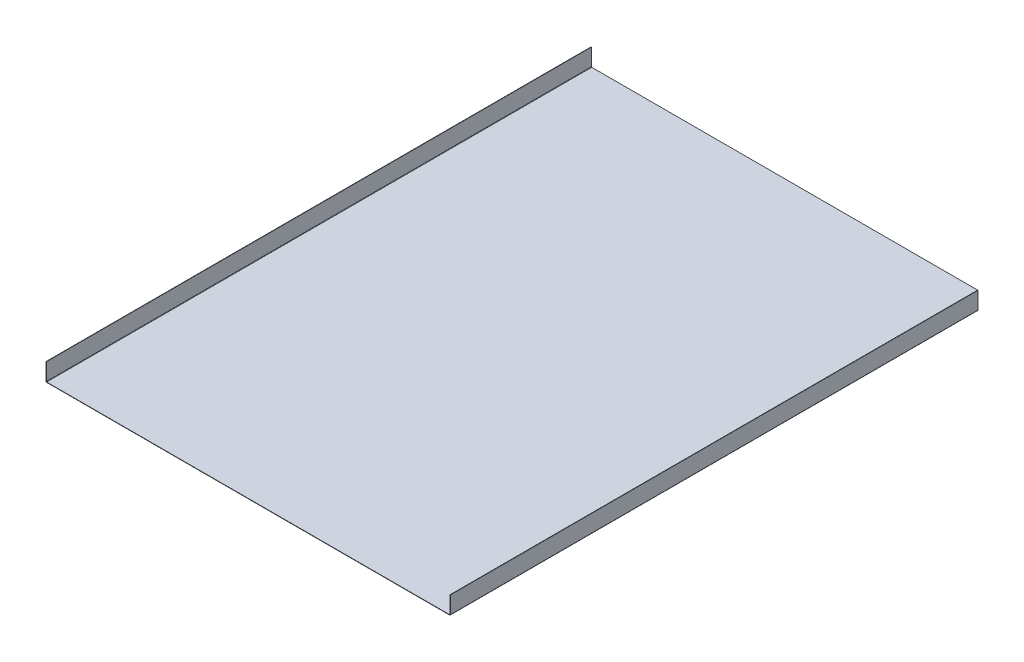
ISO-10303-21;
HEADER;
FILE_DESCRIPTION(('STEP AP214'),'2;1');
FILE_NAME('part.step','',(''),(''),'','','');
FILE_SCHEMA(('AUTOMOTIVE_DESIGN { 1 0 10303 214 1 1 1 1 }'));
ENDSEC;
DATA;
#1=APPLICATION_CONTEXT('core data for automotive mechanical design processes');
#2=APPLICATION_PROTOCOL_DEFINITION('international standard','automotive_design',2000,#1);
#3=PRODUCT_CONTEXT('',#1,'mechanical');
#4=PRODUCT('Part','Part','',(#3));
#5=PRODUCT_RELATED_PRODUCT_CATEGORY('part','',(#4));
#6=PRODUCT_DEFINITION_FORMATION('','',#4);
#7=PRODUCT_DEFINITION_CONTEXT('part definition',#1,'design');
#8=PRODUCT_DEFINITION('design','',#6,#7);
#9=PRODUCT_DEFINITION_SHAPE('','',#8);
#10=(LENGTH_UNIT() NAMED_UNIT(*) SI_UNIT(.MILLI.,.METRE.));
#11=(NAMED_UNIT(*) PLANE_ANGLE_UNIT() SI_UNIT($,.RADIAN.));
#12=(NAMED_UNIT(*) SI_UNIT($,.STERADIAN.) SOLID_ANGLE_UNIT());
#13=UNCERTAINTY_MEASURE_WITH_UNIT(LENGTH_MEASURE(1.E-05),#10,'distance_accuracy_value','');
#14=(GEOMETRIC_REPRESENTATION_CONTEXT(3) GLOBAL_UNCERTAINTY_ASSIGNED_CONTEXT((#13)) GLOBAL_UNIT_ASSIGNED_CONTEXT((#10,
#11,#12)) REPRESENTATION_CONTEXT('',''));
#15=CARTESIAN_POINT('',(0.,0.,0.));
#16=DIRECTION('',(0.,0.,1.));
#17=DIRECTION('',(1.,0.,0.));
#18=AXIS2_PLACEMENT_3D('',#15,#16,#17);
#19=CARTESIAN_POINT('',(473.8,0.,-598.));
#20=DIRECTION('',(0.,0.,1.));
#21=DIRECTION('',(0.,-1.,0.));
#22=AXIS2_PLACEMENT_3D('',#19,#20,#21);
#23=PLANE('',#22);
#24=DIRECTION('',(-1.,0.,0.));
#25=VECTOR('',#24,1.);
#26=CARTESIAN_POINT('',(473.8,0.,-598.));
#27=LINE('',#26,#25);
#28=CARTESIAN_POINT('',(473.8,0.,-598.));
#29=VERTEX_POINT('',#28);
#30=CARTESIAN_POINT('',(473.585640646055,0.,-598.));
#31=VERTEX_POINT('',#30);
#32=EDGE_CURVE('E295',#29,#31,#27,.T.);
#33=ORIENTED_EDGE('',*,*,#32,.T.);
#34=CARTESIAN_POINT('',(472.2,0.800000000000054,-598.));
#35=DIRECTION('',(0.,0.,-1.));
#36=DIRECTION('',(-1.,0.,0.));
#37=AXIS2_PLACEMENT_3D('',#34,#35,#36);
#38=CIRCLE('',#37,1.60000000000008);
#39=CARTESIAN_POINT('',(472.2,-0.8,-598.));
#40=VERTEX_POINT('',#39);
#41=EDGE_CURVE('E13',#31,#40,#38,.T.);
#42=ORIENTED_EDGE('',*,*,#41,.T.);
#43=DIRECTION('',(1.,0.,0.));
#44=VECTOR('',#43,1.);
#45=CARTESIAN_POINT('',(473.8,-0.8,-598.));
#46=LINE('',#45,#44);
#47=CARTESIAN_POINT('',(473.8,-0.8,-598.));
#48=VERTEX_POINT('',#47);
#49=EDGE_CURVE('E297',#40,#48,#46,.T.);
#50=ORIENTED_EDGE('',*,*,#49,.T.);
#51=DIRECTION('',(0.,-1.,0.));
#52=VECTOR('',#51,1.);
#53=CARTESIAN_POINT('',(473.8,-0.8,-598.));
#54=LINE('',#53,#52);
#55=EDGE_CURVE('E305',#48,#29,#54,.F.);
#56=ORIENTED_EDGE('',*,*,#55,.T.);
#57=EDGE_LOOP('',(#33,#42,#50,#56));
#58=FACE_BOUND('',#57,.T.);
#59=ADVANCED_FACE('F73',(#58),#23,.T.);
#60=CARTESIAN_POINT('',(473.8,-0.8,638.8));
#61=DIRECTION('',(0.,1.,0.));
#62=DIRECTION('',(0.,0.,1.));
#63=AXIS2_PLACEMENT_3D('',#60,#61,#62);
#64=PLANE('',#63);
#65=DIRECTION('',(0.,0.,1.));
#66=VECTOR('',#65,1.);
#67=CARTESIAN_POINT('',(-472.2,-0.800000000000109,638.8));
#68=LINE('',#67,#66);
#69=CARTESIAN_POINT('',(-472.2,-0.800000000000109,638.8));
#70=VERTEX_POINT('',#69);
#71=CARTESIAN_POINT('',(-472.2,-0.8,-638.8));
#72=VERTEX_POINT('',#71);
#73=EDGE_CURVE('E187',#70,#72,#68,.F.);
#74=ORIENTED_EDGE('',*,*,#73,.T.);
#75=DIRECTION('',(-1.,0.,0.));
#76=VECTOR('',#75,1.);
#77=CARTESIAN_POINT('',(-473.8,-0.8,-638.8));
#78=LINE('',#77,#76);
#79=CARTESIAN_POINT('',(433.,-0.8,-638.8));
#80=VERTEX_POINT('',#79);
#81=EDGE_CURVE('E310',#80,#72,#78,.T.);
#82=ORIENTED_EDGE('',*,*,#81,.F.);
#83=DIRECTION('',(0.707106781186548,0.,0.707106781186547));
#84=VECTOR('',#83,1.);
#85=CARTESIAN_POINT('',(1092.2,-0.8,20.3999999999992));
#86=LINE('',#85,#84);
#87=EDGE_CURVE('E299',#80,#48,#86,.T.);
#88=ORIENTED_EDGE('',*,*,#87,.T.);
#89=ORIENTED_EDGE('',*,*,#49,.F.);
#90=DIRECTION('',(0.,0.,-1.));
#91=VECTOR('',#90,1.);
#92=CARTESIAN_POINT('',(472.2,-0.800000000000024,-598.));
#93=LINE('',#92,#91);
#94=CARTESIAN_POINT('',(472.2,-0.8,638.8));
#95=VERTEX_POINT('',#94);
#96=EDGE_CURVE('E277',#40,#95,#93,.F.);
#97=ORIENTED_EDGE('',*,*,#96,.T.);
#98=DIRECTION('',(1.,0.,0.));
#99=VECTOR('',#98,1.);
#100=CARTESIAN_POINT('',(-473.8,-0.8,638.8));
#101=LINE('',#100,#99);
#102=EDGE_CURVE('E82',#70,#95,#101,.T.);
#103=ORIENTED_EDGE('',*,*,#102,.F.);
#104=EDGE_LOOP('',(#74,#82,#88,#89,#97,#103));
#105=FACE_BOUND('',#104,.T.);
#106=ADVANCED_FACE('F363',(#105),#64,.F.);
#107=CARTESIAN_POINT('',(473.8,0.,638.8));
#108=DIRECTION('',(0.,1.,0.));
#109=DIRECTION('',(0.,0.,1.));
#110=AXIS2_PLACEMENT_3D('',#107,#108,#109);
#111=PLANE('',#110);
#112=DIRECTION('',(-1.,0.,0.));
#113=VECTOR('',#112,1.);
#114=CARTESIAN_POINT('',(-473.8,0.,-638.8));
#115=LINE('',#114,#113);
#116=CARTESIAN_POINT('',(432.999999999999,0.,-638.8));
#117=VERTEX_POINT('',#116);
#118=CARTESIAN_POINT('',(-472.2,-1.08853898117545E-13,-638.8));
#119=VERTEX_POINT('',#118);
#120=EDGE_CURVE('E308',#117,#119,#115,.T.);
#121=ORIENTED_EDGE('',*,*,#120,.T.);
#122=DIRECTION('',(0.,0.,1.));
#123=VECTOR('',#122,1.);
#124=CARTESIAN_POINT('',(-472.2,-1.08853898117545E-13,638.8));
#125=LINE('',#124,#123);
#126=CARTESIAN_POINT('',(-472.2,-1.08853898117545E-13,638.8));
#127=VERTEX_POINT('',#126);
#128=EDGE_CURVE('E237',#127,#119,#125,.F.);
#129=ORIENTED_EDGE('',*,*,#128,.F.);
#130=DIRECTION('',(1.,0.,0.));
#131=VECTOR('',#130,1.);
#132=CARTESIAN_POINT('',(-473.8,0.,638.8));
#133=LINE('',#132,#131);
#134=CARTESIAN_POINT('',(472.2,0.,638.8));
#135=VERTEX_POINT('',#134);
#136=EDGE_CURVE('E77',#127,#135,#133,.T.);
#137=ORIENTED_EDGE('',*,*,#136,.T.);
#138=DIRECTION('',(0.,0.,-1.));
#139=VECTOR('',#138,1.);
#140=CARTESIAN_POINT('',(472.2,0.,-598.));
#141=LINE('',#140,#139);
#142=CARTESIAN_POINT('',(472.2,0.,-598.));
#143=VERTEX_POINT('',#142);
#144=EDGE_CURVE('E288',#143,#135,#141,.F.);
#145=ORIENTED_EDGE('',*,*,#144,.F.);
#146=EDGE_CURVE('E91',#31,#143,#27,.T.);
#147=ORIENTED_EDGE('',*,*,#146,.F.);
#148=ORIENTED_EDGE('',*,*,#32,.F.);
#149=DIRECTION('',(0.707106781186548,0.,0.707106781186547));
#150=VECTOR('',#149,1.);
#151=CARTESIAN_POINT('',(1092.2,0.,20.3999999999992));
#152=LINE('',#151,#150);
#153=EDGE_CURVE('E300',#117,#29,#152,.T.);
#154=ORIENTED_EDGE('',*,*,#153,.F.);
#155=EDGE_LOOP('',(#121,#129,#137,#145,#147,#148,#154));
#156=FACE_BOUND('',#155,.T.);
#157=ADVANCED_FACE('F318',(#156),#111,.T.);
#158=CARTESIAN_POINT('',(-473.8,-0.8,638.8));
#159=DIRECTION('',(0.,0.,1.));
#160=DIRECTION('',(1.,0.,0.));
#161=AXIS2_PLACEMENT_3D('',#158,#159,#160);
#162=PLANE('',#161);
#163=ORIENTED_EDGE('',*,*,#136,.F.);
#164=DIRECTION('',(1.38777878078121E-13,-1.,0.));
#165=VECTOR('',#164,1.);
#166=CARTESIAN_POINT('',(-472.2,-1.08853898117545E-13,638.8));
#167=LINE('',#166,#165);
#168=EDGE_CURVE('E233',#127,#70,#167,.T.);
#169=ORIENTED_EDGE('',*,*,#168,.T.);
#170=ORIENTED_EDGE('',*,*,#102,.T.);
#171=DIRECTION('',(0.,-1.,0.));
#172=VECTOR('',#171,1.);
#173=CARTESIAN_POINT('',(472.2,0.,638.8));
#174=LINE('',#173,#172);
#175=EDGE_CURVE('E282',#135,#95,#174,.T.);
#176=ORIENTED_EDGE('',*,*,#175,.F.);
#177=EDGE_LOOP('',(#163,#169,#170,#176));
#178=FACE_BOUND('',#177,.T.);
#179=ADVANCED_FACE('F320',(#178),#162,.T.);
#180=CARTESIAN_POINT('',(-473.8,-0.8,-638.8));
#181=DIRECTION('',(0.,0.,-1.));
#182=DIRECTION('',(-1.,0.,0.));
#183=AXIS2_PLACEMENT_3D('',#180,#181,#182);
#184=PLANE('',#183);
#185=DIRECTION('',(1.38777878078121E-13,-1.,0.));
#186=VECTOR('',#185,1.);
#187=CARTESIAN_POINT('',(-472.2,-1.08853898117545E-13,-638.8));
#188=LINE('',#187,#186);
#189=EDGE_CURVE('E241',#119,#72,#188,.T.);
#190=ORIENTED_EDGE('',*,*,#189,.F.);
#191=ORIENTED_EDGE('',*,*,#120,.F.);
#192=DIRECTION('',(0.,-1.,0.));
#193=VECTOR('',#192,1.);
#194=CARTESIAN_POINT('',(433.,-0.8,-638.8));
#195=LINE('',#194,#193);
#196=EDGE_CURVE('E302',#80,#117,#195,.F.);
#197=ORIENTED_EDGE('',*,*,#196,.F.);
#198=ORIENTED_EDGE('',*,*,#81,.T.);
#199=EDGE_LOOP('',(#190,#191,#197,#198));
#200=FACE_BOUND('',#199,.T.);
#201=ADVANCED_FACE('F75',(#200),#184,.T.);
#202=CARTESIAN_POINT('',(1092.2,-0.8,20.3999999999992));
#203=DIRECTION('',(-0.707106781186547,0.,0.707106781186548));
#204=DIRECTION('',(0.707106781186548,0.,0.707106781186547));
#205=AXIS2_PLACEMENT_3D('',#202,#203,#204);
#206=PLANE('',#205);
#207=ORIENTED_EDGE('',*,*,#55,.F.);
#208=ORIENTED_EDGE('',*,*,#87,.F.);
#209=ORIENTED_EDGE('',*,*,#196,.T.);
#210=ORIENTED_EDGE('',*,*,#153,.T.);
#211=EDGE_LOOP('',(#207,#208,#209,#210));
#212=FACE_BOUND('',#211,.T.);
#213=ADVANCED_FACE('F373',(#212),#206,.F.);
#214=CARTESIAN_POINT('',(472.2,0.800000000000054,638.8));
#215=DIRECTION('',(0.,0.,1.));
#216=DIRECTION('',(1.,0.,0.));
#217=AXIS2_PLACEMENT_3D('',#214,#215,#216);
#218=PLANE('',#217);
#219=DIRECTION('',(-1.,0.,0.));
#220=VECTOR('',#219,1.);
#221=CARTESIAN_POINT('',(473.8,0.80000000000002,638.8));
#222=LINE('',#221,#220);
#223=CARTESIAN_POINT('',(473.,0.800000000000051,638.8));
#224=VERTEX_POINT('',#223);
#225=CARTESIAN_POINT('',(473.8,0.800000000000047,638.8));
#226=VERTEX_POINT('',#225);
#227=EDGE_CURVE('E244',#224,#226,#222,.F.);
#228=ORIENTED_EDGE('',*,*,#227,.F.);
#229=CARTESIAN_POINT('',(472.2,0.800000000000054,638.8));
#230=DIRECTION('',(0.,0.,-1.));
#231=DIRECTION('',(-1.,0.,0.));
#232=AXIS2_PLACEMENT_3D('',#229,#230,#231);
#233=CIRCLE('',#232,0.800000000000078);
#234=EDGE_CURVE('E285',#135,#224,#233,.F.);
#235=ORIENTED_EDGE('',*,*,#234,.F.);
#236=ORIENTED_EDGE('',*,*,#175,.T.);
#237=CARTESIAN_POINT('',(472.2,0.800000000000054,638.8));
#238=DIRECTION('',(0.,0.,-1.));
#239=DIRECTION('',(-1.,0.,0.));
#240=AXIS2_PLACEMENT_3D('',#237,#238,#239);
#241=CIRCLE('',#240,1.60000000000008);
#242=EDGE_CURVE('E280',#95,#226,#241,.F.);
#243=ORIENTED_EDGE('',*,*,#242,.T.);
#244=EDGE_LOOP('',(#228,#235,#236,#243));
#245=FACE_BOUND('',#244,.T.);
#246=ADVANCED_FACE('F328',(#245),#218,.T.);
#247=CARTESIAN_POINT('',(472.2,0.800000000000054,-598.));
#248=DIRECTION('',(0.,0.,1.));
#249=DIRECTION('',(1.,0.,0.));
#250=AXIS2_PLACEMENT_3D('',#247,#248,#249);
#251=PLANE('',#250);
#252=CARTESIAN_POINT('',(473.8,0.800000000000075,-598.));
#253=VERTEX_POINT('',#252);
#254=EDGE_CURVE('E84',#253,#31,#38,.T.);
#255=ORIENTED_EDGE('',*,*,#254,.T.);
#256=ORIENTED_EDGE('',*,*,#146,.T.);
#257=CARTESIAN_POINT('',(472.2,0.800000000000054,-598.));
#258=DIRECTION('',(0.,0.,-1.));
#259=DIRECTION('',(-1.,0.,0.));
#260=AXIS2_PLACEMENT_3D('',#257,#258,#259);
#261=CIRCLE('',#260,0.800000000000078);
#262=CARTESIAN_POINT('',(473.,0.800000000000051,-598.));
#263=VERTEX_POINT('',#262);
#264=EDGE_CURVE('E250',#263,#143,#261,.T.);
#265=ORIENTED_EDGE('',*,*,#264,.F.);
#266=DIRECTION('',(-1.,0.,0.));
#267=VECTOR('',#266,1.);
#268=CARTESIAN_POINT('',(473.,0.800000000000078,-598.));
#269=LINE('',#268,#267);
#270=EDGE_CURVE('E270',#263,#253,#269,.F.);
#271=ORIENTED_EDGE('',*,*,#270,.T.);
#272=EDGE_LOOP('',(#255,#256,#265,#271));
#273=FACE_BOUND('',#272,.T.);
#274=ADVANCED_FACE('F348',(#273),#251,.F.);
#275=CARTESIAN_POINT('',(472.2,0.800000000000054,-598.));
#276=DIRECTION('',(0.,0.,-1.));
#277=DIRECTION('',(1.,0.,0.));
#278=AXIS2_PLACEMENT_3D('',#275,#276,#277);
#279=CYLINDRICAL_SURFACE('',#278,1.60000000000008);
#280=ORIENTED_EDGE('',*,*,#96,.F.);
#281=ORIENTED_EDGE('',*,*,#41,.F.);
#282=ORIENTED_EDGE('',*,*,#254,.F.);
#283=DIRECTION('',(0.,0.,-1.));
#284=VECTOR('',#283,1.);
#285=CARTESIAN_POINT('',(473.8,0.80000000000002,638.8));
#286=LINE('',#285,#284);
#287=EDGE_CURVE('E268',#253,#226,#286,.F.);
#288=ORIENTED_EDGE('',*,*,#287,.T.);
#289=ORIENTED_EDGE('',*,*,#242,.F.);
#290=EDGE_LOOP('',(#280,#281,#282,#288,#289));
#291=FACE_BOUND('',#290,.T.);
#292=ADVANCED_FACE('F358',(#291),#279,.T.);
#293=CARTESIAN_POINT('',(472.2,0.800000000000054,-598.));
#294=DIRECTION('',(0.,0.,-1.));
#295=DIRECTION('',(1.,0.,0.));
#296=AXIS2_PLACEMENT_3D('',#293,#294,#295);
#297=CYLINDRICAL_SURFACE('',#296,0.800000000000078);
#298=ORIENTED_EDGE('',*,*,#144,.T.);
#299=ORIENTED_EDGE('',*,*,#234,.T.);
#300=DIRECTION('',(0.,0.,-1.));
#301=VECTOR('',#300,1.);
#302=CARTESIAN_POINT('',(473.,0.800000000000023,638.8));
#303=LINE('',#302,#301);
#304=EDGE_CURVE('E273',#224,#263,#303,.T.);
#305=ORIENTED_EDGE('',*,*,#304,.T.);
#306=ORIENTED_EDGE('',*,*,#264,.T.);
#307=EDGE_LOOP('',(#298,#299,#305,#306));
#308=FACE_BOUND('',#307,.T.);
#309=ADVANCED_FACE('F325',(#308),#297,.F.);
#310=CARTESIAN_POINT('',(473.8,40.8,-598.));
#311=DIRECTION('',(0.,0.,1.));
#312=DIRECTION('',(1.,0.,0.));
#313=AXIS2_PLACEMENT_3D('',#310,#311,#312);
#314=PLANE('',#313);
#315=ORIENTED_EDGE('',*,*,#270,.F.);
#316=DIRECTION('',(0.,-1.,0.));
#317=VECTOR('',#316,1.);
#318=CARTESIAN_POINT('',(473.,40.8,-598.));
#319=LINE('',#318,#317);
#320=CARTESIAN_POINT('',(473.,40.8,-598.));
#321=VERTEX_POINT('',#320);
#322=EDGE_CURVE('E266',#263,#321,#319,.F.);
#323=ORIENTED_EDGE('',*,*,#322,.T.);
#324=DIRECTION('',(-1.,0.,0.));
#325=VECTOR('',#324,1.);
#326=CARTESIAN_POINT('',(473.8,40.8,-598.));
#327=LINE('',#326,#325);
#328=CARTESIAN_POINT('',(473.8,40.8,-598.));
#329=VERTEX_POINT('',#328);
#330=EDGE_CURVE('E247',#329,#321,#327,.T.);
#331=ORIENTED_EDGE('',*,*,#330,.F.);
#332=DIRECTION('',(0.,1.,0.));
#333=VECTOR('',#332,1.);
#334=CARTESIAN_POINT('',(473.8,0.,-598.));
#335=LINE('',#334,#333);
#336=EDGE_CURVE('E259',#253,#329,#335,.T.);
#337=ORIENTED_EDGE('',*,*,#336,.F.);
#338=EDGE_LOOP('',(#315,#323,#331,#337));
#339=FACE_BOUND('',#338,.T.);
#340=ADVANCED_FACE('F350',(#339),#314,.F.);
#341=CARTESIAN_POINT('',(473.8,0.,638.8));
#342=DIRECTION('',(0.,0.,-1.));
#343=DIRECTION('',(-1.,0.,0.));
#344=AXIS2_PLACEMENT_3D('',#341,#342,#343);
#345=PLANE('',#344);
#346=ORIENTED_EDGE('',*,*,#227,.T.);
#347=DIRECTION('',(0.,-1.,0.));
#348=VECTOR('',#347,1.);
#349=CARTESIAN_POINT('',(473.8,0.,638.8));
#350=LINE('',#349,#348);
#351=CARTESIAN_POINT('',(473.8,40.8,638.8));
#352=VERTEX_POINT('',#351);
#353=EDGE_CURVE('E254',#352,#226,#350,.T.);
#354=ORIENTED_EDGE('',*,*,#353,.F.);
#355=DIRECTION('',(-1.,0.,0.));
#356=VECTOR('',#355,1.);
#357=CARTESIAN_POINT('',(473.8,40.8,638.8));
#358=LINE('',#357,#356);
#359=CARTESIAN_POINT('',(473.,40.8,638.8));
#360=VERTEX_POINT('',#359);
#361=EDGE_CURVE('E251',#352,#360,#358,.T.);
#362=ORIENTED_EDGE('',*,*,#361,.T.);
#363=DIRECTION('',(0.,1.,0.));
#364=VECTOR('',#363,1.);
#365=CARTESIAN_POINT('',(473.,0.,638.8));
#366=LINE('',#365,#364);
#367=EDGE_CURVE('E261',#360,#224,#366,.F.);
#368=ORIENTED_EDGE('',*,*,#367,.T.);
#369=EDGE_LOOP('',(#346,#354,#362,#368));
#370=FACE_BOUND('',#369,.T.);
#371=ADVANCED_FACE('F331',(#370),#345,.F.);
#372=CARTESIAN_POINT('',(473.8,0.,-598.));
#373=DIRECTION('',(-1.,0.,0.));
#374=DIRECTION('',(0.,-1.,0.));
#375=AXIS2_PLACEMENT_3D('',#372,#373,#374);
#376=PLANE('',#375);
#377=ORIENTED_EDGE('',*,*,#287,.F.);
#378=ORIENTED_EDGE('',*,*,#336,.T.);
#379=DIRECTION('',(0.,0.,1.));
#380=VECTOR('',#379,1.);
#381=CARTESIAN_POINT('',(473.8,40.8,-598.));
#382=LINE('',#381,#380);
#383=EDGE_CURVE('E257',#329,#352,#382,.T.);
#384=ORIENTED_EDGE('',*,*,#383,.T.);
#385=ORIENTED_EDGE('',*,*,#353,.T.);
#386=EDGE_LOOP('',(#377,#378,#384,#385));
#387=FACE_BOUND('',#386,.T.);
#388=ADVANCED_FACE('F335',(#387),#376,.F.);
#389=CARTESIAN_POINT('',(473.,0.,-598.));
#390=DIRECTION('',(-1.,0.,0.));
#391=DIRECTION('',(0.,-1.,0.));
#392=AXIS2_PLACEMENT_3D('',#389,#390,#391);
#393=PLANE('',#392);
#394=ORIENTED_EDGE('',*,*,#322,.F.);
#395=ORIENTED_EDGE('',*,*,#304,.F.);
#396=ORIENTED_EDGE('',*,*,#367,.F.);
#397=DIRECTION('',(0.,0.,-1.));
#398=VECTOR('',#397,1.);
#399=CARTESIAN_POINT('',(473.,40.8,638.8));
#400=LINE('',#399,#398);
#401=EDGE_CURVE('E264',#321,#360,#400,.F.);
#402=ORIENTED_EDGE('',*,*,#401,.F.);
#403=EDGE_LOOP('',(#394,#395,#396,#402));
#404=FACE_BOUND('',#403,.T.);
#405=ADVANCED_FACE('F345',(#404),#393,.T.);
#406=CARTESIAN_POINT('',(473.8,40.8,638.8));
#407=DIRECTION('',(0.,-1.,0.));
#408=DIRECTION('',(1.,0.,0.));
#409=AXIS2_PLACEMENT_3D('',#406,#407,#408);
#410=PLANE('',#409);
#411=ORIENTED_EDGE('',*,*,#401,.T.);
#412=ORIENTED_EDGE('',*,*,#361,.F.);
#413=ORIENTED_EDGE('',*,*,#383,.F.);
#414=ORIENTED_EDGE('',*,*,#330,.T.);
#415=EDGE_LOOP('',(#411,#412,#413,#414));
#416=FACE_BOUND('',#415,.T.);
#417=ADVANCED_FACE('F341',(#416),#410,.F.);
#418=CARTESIAN_POINT('',(-472.2,0.800000000000025,-638.8));
#419=DIRECTION('',(0.,0.,-1.));
#420=DIRECTION('',(-1.,0.,0.));
#421=AXIS2_PLACEMENT_3D('',#418,#419,#420);
#422=PLANE('',#421);
#423=DIRECTION('',(1.,0.,0.));
#424=VECTOR('',#423,1.);
#425=CARTESIAN_POINT('',(-473.8,0.800000000000023,-638.8));
#426=LINE('',#425,#424);
#427=CARTESIAN_POINT('',(-473.,0.800000000000023,-638.8));
#428=VERTEX_POINT('',#427);
#429=CARTESIAN_POINT('',(-473.8,0.800000000000021,-638.8));
#430=VERTEX_POINT('',#429);
#431=EDGE_CURVE('E228',#428,#430,#426,.F.);
#432=ORIENTED_EDGE('',*,*,#431,.F.);
#433=CARTESIAN_POINT('',(-472.2,0.800000000000025,-638.8));
#434=DIRECTION('',(0.,0.,1.));
#435=DIRECTION('',(1.,0.,0.));
#436=AXIS2_PLACEMENT_3D('',#433,#434,#435);
#437=CIRCLE('',#436,0.800000000000134);
#438=EDGE_CURVE('E190',#119,#428,#437,.F.);
#439=ORIENTED_EDGE('',*,*,#438,.F.);
#440=ORIENTED_EDGE('',*,*,#189,.T.);
#441=CARTESIAN_POINT('',(-472.2,0.800000000000025,-638.8));
#442=DIRECTION('',(0.,0.,1.));
#443=DIRECTION('',(1.,0.,0.));
#444=AXIS2_PLACEMENT_3D('',#441,#442,#443);
#445=CIRCLE('',#444,1.60000000000013);
#446=EDGE_CURVE('E232',#72,#430,#445,.F.);
#447=ORIENTED_EDGE('',*,*,#446,.T.);
#448=EDGE_LOOP('',(#432,#439,#440,#447));
#449=FACE_BOUND('',#448,.T.);
#450=ADVANCED_FACE('F389',(#449),#422,.T.);
#451=CARTESIAN_POINT('',(-472.2,0.800000000000025,638.8));
#452=DIRECTION('',(0.,0.,-1.));
#453=DIRECTION('',(-1.,0.,0.));
#454=AXIS2_PLACEMENT_3D('',#451,#452,#453);
#455=PLANE('',#454);
#456=CARTESIAN_POINT('',(-472.2,0.800000000000025,638.8));
#457=DIRECTION('',(0.,0.,1.));
#458=DIRECTION('',(1.,0.,0.));
#459=AXIS2_PLACEMENT_3D('',#456,#457,#458);
#460=CIRCLE('',#459,0.800000000000134);
#461=CARTESIAN_POINT('',(-473.,0.800000000000023,638.8));
#462=VERTEX_POINT('',#461);
#463=EDGE_CURVE('E197',#462,#127,#460,.T.);
#464=ORIENTED_EDGE('',*,*,#463,.F.);
#465=DIRECTION('',(1.,0.,0.));
#466=VECTOR('',#465,1.);
#467=CARTESIAN_POINT('',(-473.,0.800000000000023,638.8));
#468=LINE('',#467,#466);
#469=CARTESIAN_POINT('',(-473.8,0.800000000000021,638.8));
#470=VERTEX_POINT('',#469);
#471=EDGE_CURVE('E194',#462,#470,#468,.F.);
#472=ORIENTED_EDGE('',*,*,#471,.T.);
#473=CARTESIAN_POINT('',(-472.2,0.800000000000025,638.8));
#474=DIRECTION('',(0.,0.,1.));
#475=DIRECTION('',(1.,0.,0.));
#476=AXIS2_PLACEMENT_3D('',#473,#474,#475);
#477=CIRCLE('',#476,1.60000000000013);
#478=EDGE_CURVE('E180',#470,#70,#477,.T.);
#479=ORIENTED_EDGE('',*,*,#478,.T.);
#480=ORIENTED_EDGE('',*,*,#168,.F.);
#481=EDGE_LOOP('',(#464,#472,#479,#480));
#482=FACE_BOUND('',#481,.T.);
#483=ADVANCED_FACE('F195',(#482),#455,.F.);
#484=CARTESIAN_POINT('',(-472.2,0.800000000000025,638.8));
#485=DIRECTION('',(0.,0.,1.));
#486=DIRECTION('',(-1.,0.,0.));
#487=AXIS2_PLACEMENT_3D('',#484,#485,#486);
#488=CYLINDRICAL_SURFACE('',#487,1.60000000000013);
#489=ORIENTED_EDGE('',*,*,#73,.F.);
#490=ORIENTED_EDGE('',*,*,#478,.F.);
#491=DIRECTION('',(0.,0.,1.));
#492=VECTOR('',#491,1.);
#493=CARTESIAN_POINT('',(-473.8,0.800000000000021,638.8));
#494=LINE('',#493,#492);
#495=EDGE_CURVE('E185',#430,#470,#494,.T.);
#496=ORIENTED_EDGE('',*,*,#495,.F.);
#497=ORIENTED_EDGE('',*,*,#446,.F.);
#498=EDGE_LOOP('',(#489,#490,#496,#497));
#499=FACE_BOUND('',#498,.T.);
#500=ADVANCED_FACE('F182',(#499),#488,.T.);
#501=CARTESIAN_POINT('',(-472.2,0.800000000000025,638.8));
#502=DIRECTION('',(0.,0.,1.));
#503=DIRECTION('',(-1.,0.,0.));
#504=AXIS2_PLACEMENT_3D('',#501,#502,#503);
#505=CYLINDRICAL_SURFACE('',#504,0.800000000000134);
#506=ORIENTED_EDGE('',*,*,#128,.T.);
#507=ORIENTED_EDGE('',*,*,#438,.T.);
#508=DIRECTION('',(0.,0.,-1.));
#509=VECTOR('',#508,1.);
#510=CARTESIAN_POINT('',(-473.,0.800000000000023,-638.8));
#511=LINE('',#510,#509);
#512=EDGE_CURVE('E201',#428,#462,#511,.F.);
#513=ORIENTED_EDGE('',*,*,#512,.T.);
#514=ORIENTED_EDGE('',*,*,#463,.T.);
#515=EDGE_LOOP('',(#506,#507,#513,#514));
#516=FACE_BOUND('',#515,.T.);
#517=ADVANCED_FACE('F392',(#516),#505,.F.);
#518=CARTESIAN_POINT('',(-473.8,0.,638.8));
#519=DIRECTION('',(0.,0.,-1.));
#520=DIRECTION('',(0.,1.,0.));
#521=AXIS2_PLACEMENT_3D('',#518,#519,#520);
#522=PLANE('',#521);
#523=ORIENTED_EDGE('',*,*,#471,.F.);
#524=DIRECTION('',(0.,1.,0.));
#525=VECTOR('',#524,1.);
#526=CARTESIAN_POINT('',(-473.,0.,638.8));
#527=LINE('',#526,#525);
#528=CARTESIAN_POINT('',(-473.,40.8,638.8));
#529=VERTEX_POINT('',#528);
#530=EDGE_CURVE('E210',#462,#529,#527,.T.);
#531=ORIENTED_EDGE('',*,*,#530,.T.);
#532=DIRECTION('',(1.,0.,0.));
#533=VECTOR('',#532,1.);
#534=CARTESIAN_POINT('',(-473.8,40.8,638.8));
#535=LINE('',#534,#533);
#536=CARTESIAN_POINT('',(-473.8,40.8,638.8));
#537=VERTEX_POINT('',#536);
#538=EDGE_CURVE('E214',#537,#529,#535,.T.);
#539=ORIENTED_EDGE('',*,*,#538,.F.);
#540=DIRECTION('',(0.,-1.,0.));
#541=VECTOR('',#540,1.);
#542=CARTESIAN_POINT('',(-473.8,0.,638.8));
#543=LINE('',#542,#541);
#544=EDGE_CURVE('E206',#470,#537,#543,.F.);
#545=ORIENTED_EDGE('',*,*,#544,.F.);
#546=EDGE_LOOP('',(#523,#531,#539,#545));
#547=FACE_BOUND('',#546,.T.);
#548=ADVANCED_FACE('F212',(#547),#522,.F.);
#549=CARTESIAN_POINT('',(-473.8,40.8,-638.8));
#550=DIRECTION('',(0.,0.,1.));
#551=DIRECTION('',(0.,-1.,0.));
#552=AXIS2_PLACEMENT_3D('',#549,#550,#551);
#553=PLANE('',#552);
#554=ORIENTED_EDGE('',*,*,#431,.T.);
#555=DIRECTION('',(0.,1.,0.));
#556=VECTOR('',#555,1.);
#557=CARTESIAN_POINT('',(-473.8,3.47372871591185E-12,-638.8));
#558=LINE('',#557,#556);
#559=CARTESIAN_POINT('',(-473.8,40.8,-638.8));
#560=VERTEX_POINT('',#559);
#561=EDGE_CURVE('E209',#560,#430,#558,.F.);
#562=ORIENTED_EDGE('',*,*,#561,.F.);
#563=DIRECTION('',(1.,0.,0.));
#564=VECTOR('',#563,1.);
#565=CARTESIAN_POINT('',(-473.8,40.8,-638.8));
#566=LINE('',#565,#564);
#567=CARTESIAN_POINT('',(-473.,40.8,-638.8));
#568=VERTEX_POINT('',#567);
#569=EDGE_CURVE('E401',#560,#568,#566,.T.);
#570=ORIENTED_EDGE('',*,*,#569,.T.);
#571=DIRECTION('',(0.,-1.,0.));
#572=VECTOR('',#571,1.);
#573=CARTESIAN_POINT('',(-473.,40.8,-638.8));
#574=LINE('',#573,#572);
#575=EDGE_CURVE('E217',#568,#428,#574,.T.);
#576=ORIENTED_EDGE('',*,*,#575,.T.);
#577=EDGE_LOOP('',(#554,#562,#570,#576));
#578=FACE_BOUND('',#577,.T.);
#579=ADVANCED_FACE('F399',(#578),#553,.F.);
#580=CARTESIAN_POINT('',(-473.8,0.,638.8));
#581=DIRECTION('',(-1.,0.,0.));
#582=DIRECTION('',(0.,-1.,0.));
#583=AXIS2_PLACEMENT_3D('',#580,#581,#582);
#584=PLANE('',#583);
#585=ORIENTED_EDGE('',*,*,#561,.T.);
#586=ORIENTED_EDGE('',*,*,#495,.T.);
#587=ORIENTED_EDGE('',*,*,#544,.T.);
#588=DIRECTION('',(0.,0.,1.));
#589=VECTOR('',#588,1.);
#590=CARTESIAN_POINT('',(-473.8,40.8,638.8));
#591=LINE('',#590,#589);
#592=EDGE_CURVE('E216',#537,#560,#591,.F.);
#593=ORIENTED_EDGE('',*,*,#592,.T.);
#594=EDGE_LOOP('',(#585,#586,#587,#593));
#595=FACE_BOUND('',#594,.T.);
#596=ADVANCED_FACE('F205',(#595),#584,.T.);
#597=CARTESIAN_POINT('',(-473.,0.,638.8));
#598=DIRECTION('',(-1.,0.,0.));
#599=DIRECTION('',(0.,-1.,0.));
#600=AXIS2_PLACEMENT_3D('',#597,#598,#599);
#601=PLANE('',#600);
#602=ORIENTED_EDGE('',*,*,#512,.F.);
#603=ORIENTED_EDGE('',*,*,#575,.F.);
#604=DIRECTION('',(0.,0.,-1.));
#605=VECTOR('',#604,1.);
#606=CARTESIAN_POINT('',(-473.,40.8,638.8));
#607=LINE('',#606,#605);
#608=EDGE_CURVE('E221',#529,#568,#607,.T.);
#609=ORIENTED_EDGE('',*,*,#608,.F.);
#610=ORIENTED_EDGE('',*,*,#530,.F.);
#611=EDGE_LOOP('',(#602,#603,#609,#610));
#612=FACE_BOUND('',#611,.T.);
#613=ADVANCED_FACE('F395',(#612),#601,.F.);
#614=CARTESIAN_POINT('',(-473.8,40.8,638.8));
#615=DIRECTION('',(0.,-1.,0.));
#616=DIRECTION('',(1.,0.,0.));
#617=AXIS2_PLACEMENT_3D('',#614,#615,#616);
#618=PLANE('',#617);
#619=ORIENTED_EDGE('',*,*,#608,.T.);
#620=ORIENTED_EDGE('',*,*,#569,.F.);
#621=ORIENTED_EDGE('',*,*,#592,.F.);
#622=ORIENTED_EDGE('',*,*,#538,.T.);
#623=EDGE_LOOP('',(#619,#620,#621,#622));
#624=FACE_BOUND('',#623,.T.);
#625=ADVANCED_FACE('F405',(#624),#618,.F.);
#626=CLOSED_SHELL('',(#59,#106,#157,#179,#201,#213,#246,#274,#292,#309,#340,#371,#388,#405,#417,
#450,#483,#500,#517,#548,#579,#596,#613,#625));
#627=MANIFOLD_SOLID_BREP('B2',#626);
#628=ADVANCED_BREP_SHAPE_REPRESENTATION('',(#18,#627),#14);
#629=SHAPE_DEFINITION_REPRESENTATION(#9,#628);
ENDSEC;
END-ISO-10303-21;
